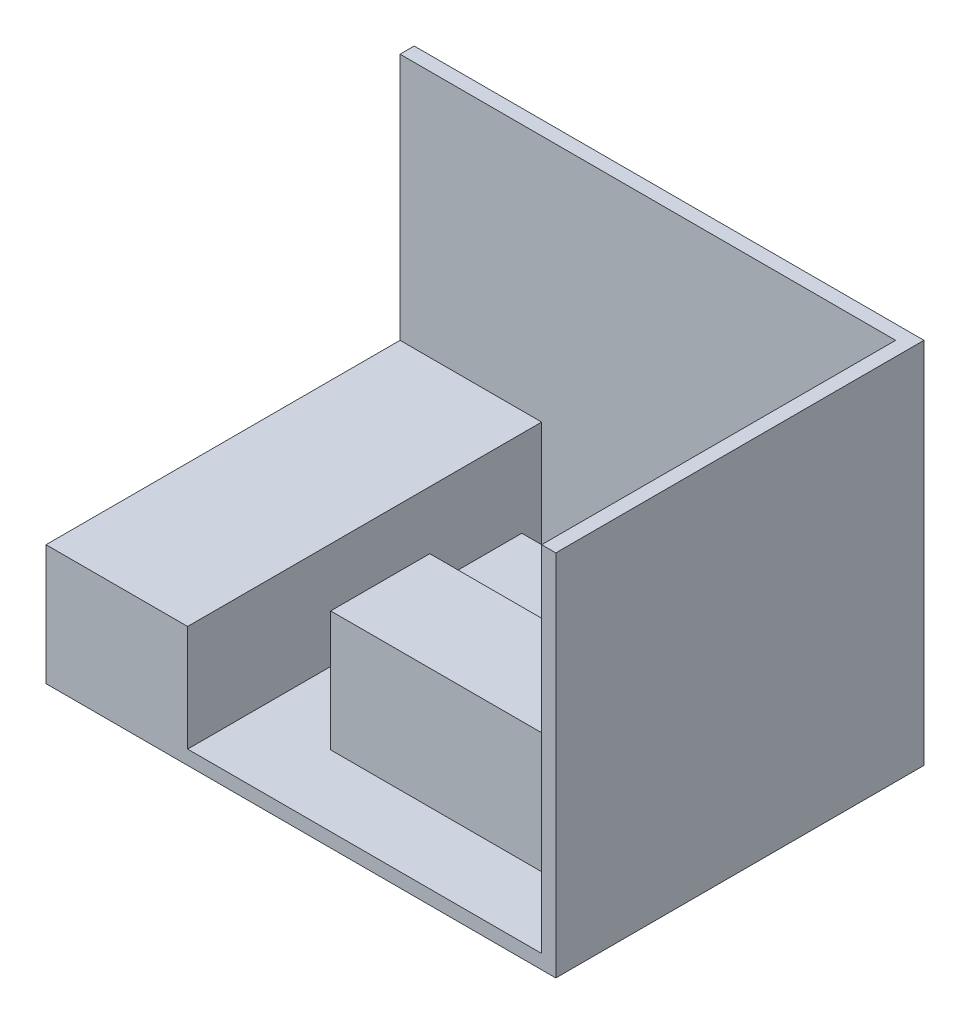
ISO-10303-21;
HEADER;
FILE_DESCRIPTION(('STEP AP214'),'2;1');
FILE_NAME('part.step','',(''),(''),'','','');
FILE_SCHEMA(('AUTOMOTIVE_DESIGN { 1 0 10303 214 1 1 1 1 }'));
ENDSEC;
DATA;
#1=APPLICATION_CONTEXT('core data for automotive mechanical design processes');
#2=APPLICATION_PROTOCOL_DEFINITION('international standard','automotive_design',2000,#1);
#3=PRODUCT_CONTEXT('',#1,'mechanical');
#4=PRODUCT('Part','Part','',(#3));
#5=PRODUCT_RELATED_PRODUCT_CATEGORY('part','',(#4));
#6=PRODUCT_DEFINITION_FORMATION('','',#4);
#7=PRODUCT_DEFINITION_CONTEXT('part definition',#1,'design');
#8=PRODUCT_DEFINITION('design','',#6,#7);
#9=PRODUCT_DEFINITION_SHAPE('','',#8);
#10=(LENGTH_UNIT() NAMED_UNIT(*) SI_UNIT(.MILLI.,.METRE.));
#11=(NAMED_UNIT(*) PLANE_ANGLE_UNIT() SI_UNIT($,.RADIAN.));
#12=(NAMED_UNIT(*) SI_UNIT($,.STERADIAN.) SOLID_ANGLE_UNIT());
#13=UNCERTAINTY_MEASURE_WITH_UNIT(LENGTH_MEASURE(1.E-05),#10,'distance_accuracy_value','');
#14=(GEOMETRIC_REPRESENTATION_CONTEXT(3) GLOBAL_UNCERTAINTY_ASSIGNED_CONTEXT((#13)) GLOBAL_UNIT_ASSIGNED_CONTEXT((#10,
#11,#12)) REPRESENTATION_CONTEXT('',''));
#15=CARTESIAN_POINT('',(0.,0.,0.));
#16=DIRECTION('',(0.,0.,1.));
#17=DIRECTION('',(1.,0.,0.));
#18=AXIS2_PLACEMENT_3D('',#15,#16,#17);
#19=CARTESIAN_POINT('',(0.,100.,0.));
#20=DIRECTION('',(0.,1.,0.));
#21=DIRECTION('',(0.,0.,1.));
#22=AXIS2_PLACEMENT_3D('',#19,#20,#21);
#23=PLANE('',#22);
#24=DIRECTION('',(1.,0.,0.));
#25=VECTOR('',#24,1.);
#26=CARTESIAN_POINT('',(3500.,100.,-2500.));
#27=LINE('',#26,#25);
#28=CARTESIAN_POINT('',(1000.,100.,-2500.));
#29=VERTEX_POINT('',#28);
#30=CARTESIAN_POINT('',(3500.,100.,-2500.));
#31=VERTEX_POINT('',#30);
#32=EDGE_CURVE('E246',#29,#31,#27,.T.);
#33=ORIENTED_EDGE('',*,*,#32,.F.);
#34=DIRECTION('',(0.,0.,-1.));
#35=VECTOR('',#34,1.);
#36=CARTESIAN_POINT('',(1000.,100.,0.));
#37=LINE('',#36,#35);
#38=CARTESIAN_POINT('',(1000.,100.,0.));
#39=VERTEX_POINT('',#38);
#40=EDGE_CURVE('E67',#39,#29,#37,.T.);
#41=ORIENTED_EDGE('',*,*,#40,.F.);
#42=DIRECTION('',(1.,0.,0.));
#43=VECTOR('',#42,1.);
#44=CARTESIAN_POINT('',(0.,100.,0.));
#45=LINE('',#44,#43);
#46=CARTESIAN_POINT('',(3500.,100.,0.));
#47=VERTEX_POINT('',#46);
#48=EDGE_CURVE('E287',#39,#47,#45,.T.);
#49=ORIENTED_EDGE('',*,*,#48,.T.);
#50=DIRECTION('',(0.,0.,1.));
#51=VECTOR('',#50,1.);
#52=CARTESIAN_POINT('',(3500.,100.,-2.22044604925031E-13));
#53=LINE('',#52,#51);
#54=CARTESIAN_POINT('',(3500.,100.,-500.));
#55=VERTEX_POINT('',#54);
#56=EDGE_CURVE('E272',#55,#47,#53,.T.);
#57=ORIENTED_EDGE('',*,*,#56,.F.);
#58=DIRECTION('',(1.,0.,0.));
#59=VECTOR('',#58,1.);
#60=CARTESIAN_POINT('',(3510.,100.,-500.));
#61=LINE('',#60,#59);
#62=CARTESIAN_POINT('',(1510.,100.,-500.));
#63=VERTEX_POINT('',#62);
#64=EDGE_CURVE('E225',#63,#55,#61,.T.);
#65=ORIENTED_EDGE('',*,*,#64,.F.);
#66=DIRECTION('',(0.,0.,1.));
#67=VECTOR('',#66,1.);
#68=CARTESIAN_POINT('',(1510.,100.,-500.));
#69=LINE('',#68,#67);
#70=CARTESIAN_POINT('',(1510.,100.,-1200.));
#71=VERTEX_POINT('',#70);
#72=EDGE_CURVE('E234',#71,#63,#69,.T.);
#73=ORIENTED_EDGE('',*,*,#72,.F.);
#74=DIRECTION('',(-1.,0.,0.));
#75=VECTOR('',#74,1.);
#76=CARTESIAN_POINT('',(3510.,100.,-1200.));
#77=LINE('',#76,#75);
#78=CARTESIAN_POINT('',(3500.,100.,-1200.));
#79=VERTEX_POINT('',#78);
#80=EDGE_CURVE('E220',#79,#71,#77,.T.);
#81=ORIENTED_EDGE('',*,*,#80,.F.);
#82=EDGE_CURVE('E252',#31,#79,#53,.T.);
#83=ORIENTED_EDGE('',*,*,#82,.F.);
#84=EDGE_LOOP('',(#33,#41,#49,#57,#65,#73,#81,#83));
#85=FACE_BOUND('',#84,.T.);
#86=DIRECTION('',(1.,0.,0.));
#87=VECTOR('',#86,1.);
#88=CARTESIAN_POINT('',(1610.,100.,-1250.));
#89=LINE('',#88,#87);
#90=CARTESIAN_POINT('',(1610.,100.,-1250.));
#91=VERTEX_POINT('',#90);
#92=CARTESIAN_POINT('',(2310.,100.,-1250.));
#93=VERTEX_POINT('',#92);
#94=EDGE_CURVE('E510',#91,#93,#89,.T.);
#95=ORIENTED_EDGE('',*,*,#94,.F.);
#96=DIRECTION('',(0.,0.,1.));
#97=VECTOR('',#96,1.);
#98=CARTESIAN_POINT('',(1610.,100.,-1250.));
#99=LINE('',#98,#97);
#100=CARTESIAN_POINT('',(1610.,100.,-1750.));
#101=VERTEX_POINT('',#100);
#102=EDGE_CURVE('E188',#101,#91,#99,.T.);
#103=ORIENTED_EDGE('',*,*,#102,.F.);
#104=DIRECTION('',(-1.,0.,0.));
#105=VECTOR('',#104,1.);
#106=CARTESIAN_POINT('',(1610.,100.,-1750.));
#107=LINE('',#106,#105);
#108=CARTESIAN_POINT('',(2310.,100.,-1750.));
#109=VERTEX_POINT('',#108);
#110=EDGE_CURVE('E184',#109,#101,#107,.T.);
#111=ORIENTED_EDGE('',*,*,#110,.F.);
#112=DIRECTION('',(0.,0.,-1.));
#113=VECTOR('',#112,1.);
#114=CARTESIAN_POINT('',(2310.,100.,-1250.));
#115=LINE('',#114,#113);
#116=EDGE_CURVE('E506',#93,#109,#115,.T.);
#117=ORIENTED_EDGE('',*,*,#116,.F.);
#118=EDGE_LOOP('',(#95,#103,#111,#117));
#119=FACE_BOUND('',#118,.T.);
#120=ADVANCED_FACE('F43',(#85,#119),#23,.T.);
#121=CARTESIAN_POINT('',(3500.,2600.,-2500.));
#122=DIRECTION('',(0.,0.,-1.));
#123=DIRECTION('',(-1.,0.,0.));
#124=AXIS2_PLACEMENT_3D('',#121,#122,#123);
#125=PLANE('',#124);
#126=DIRECTION('',(0.,-1.,0.));
#127=VECTOR('',#126,1.);
#128=CARTESIAN_POINT('',(1000.,850.,-2500.));
#129=LINE('',#128,#127);
#130=CARTESIAN_POINT('',(1000.,850.,-2500.));
#131=VERTEX_POINT('',#130);
#132=EDGE_CURVE('E212',#131,#29,#129,.T.);
#133=ORIENTED_EDGE('',*,*,#132,.T.);
#134=ORIENTED_EDGE('',*,*,#32,.T.);
#135=DIRECTION('',(0.,-1.,0.));
#136=VECTOR('',#135,1.);
#137=CARTESIAN_POINT('',(3500.,2600.,-2500.));
#138=LINE('',#137,#136);
#139=CARTESIAN_POINT('',(3500.,2600.,-2500.));
#140=VERTEX_POINT('',#139);
#141=EDGE_CURVE('E279',#140,#31,#138,.T.);
#142=ORIENTED_EDGE('',*,*,#141,.F.);
#143=DIRECTION('',(1.,0.,0.));
#144=VECTOR('',#143,1.);
#145=CARTESIAN_POINT('',(3500.,2600.,-2500.));
#146=LINE('',#145,#144);
#147=CARTESIAN_POINT('',(0.,2600.,-2500.));
#148=VERTEX_POINT('',#147);
#149=EDGE_CURVE('E259',#148,#140,#146,.T.);
#150=ORIENTED_EDGE('',*,*,#149,.F.);
#151=DIRECTION('',(0.,-1.,0.));
#152=VECTOR('',#151,1.);
#153=CARTESIAN_POINT('',(0.,2600.,-2500.));
#154=LINE('',#153,#152);
#155=CARTESIAN_POINT('',(0.,850.,-2500.));
#156=VERTEX_POINT('',#155);
#157=EDGE_CURVE('E283',#148,#156,#154,.T.);
#158=ORIENTED_EDGE('',*,*,#157,.T.);
#159=DIRECTION('',(-1.,0.,0.));
#160=VECTOR('',#159,1.);
#161=CARTESIAN_POINT('',(0.,850.,-2500.));
#162=LINE('',#161,#160);
#163=EDGE_CURVE('E209',#131,#156,#162,.T.);
#164=ORIENTED_EDGE('',*,*,#163,.F.);
#165=EDGE_LOOP('',(#133,#134,#142,#150,#158,#164));
#166=FACE_BOUND('',#165,.T.);
#167=ADVANCED_FACE('F371',(#166),#125,.F.);
#168=CARTESIAN_POINT('',(3500.,2600.,-2.22044604925031E-13));
#169=DIRECTION('',(1.,0.,0.));
#170=DIRECTION('',(0.,0.,-1.));
#171=AXIS2_PLACEMENT_3D('',#168,#169,#170);
#172=PLANE('',#171);
#173=DIRECTION('',(0.,-1.,0.));
#174=VECTOR('',#173,1.);
#175=CARTESIAN_POINT('',(3500.,2600.,-1200.));
#176=LINE('',#175,#174);
#177=CARTESIAN_POINT('',(3500.,950.,-1200.));
#178=VERTEX_POINT('',#177);
#179=EDGE_CURVE('E11',#178,#79,#176,.T.);
#180=ORIENTED_EDGE('',*,*,#179,.F.);
#181=DIRECTION('',(0.,0.,1.));
#182=VECTOR('',#181,1.);
#183=CARTESIAN_POINT('',(3500.,950.,-2.22044604925031E-13));
#184=LINE('',#183,#182);
#185=CARTESIAN_POINT('',(3500.,950.,-500.));
#186=VERTEX_POINT('',#185);
#187=EDGE_CURVE('E318',#178,#186,#184,.T.);
#188=ORIENTED_EDGE('',*,*,#187,.T.);
#189=DIRECTION('',(0.,1.,0.));
#190=VECTOR('',#189,1.);
#191=CARTESIAN_POINT('',(3500.,2600.,-500.));
#192=LINE('',#191,#190);
#193=EDGE_CURVE('E52',#55,#186,#192,.T.);
#194=ORIENTED_EDGE('',*,*,#193,.F.);
#195=ORIENTED_EDGE('',*,*,#56,.T.);
#196=DIRECTION('',(0.,-1.,0.));
#197=VECTOR('',#196,1.);
#198=CARTESIAN_POINT('',(3500.,2600.,-2.22044604925031E-13));
#199=LINE('',#198,#197);
#200=CARTESIAN_POINT('',(3500.,2600.,-2.22044604925031E-13));
#201=VERTEX_POINT('',#200);
#202=EDGE_CURVE('E269',#201,#47,#199,.T.);
#203=ORIENTED_EDGE('',*,*,#202,.F.);
#204=DIRECTION('',(0.,0.,1.));
#205=VECTOR('',#204,1.);
#206=CARTESIAN_POINT('',(3500.,2600.,-2.22044604925031E-13));
#207=LINE('',#206,#205);
#208=EDGE_CURVE('E262',#140,#201,#207,.T.);
#209=ORIENTED_EDGE('',*,*,#208,.F.);
#210=ORIENTED_EDGE('',*,*,#141,.T.);
#211=ORIENTED_EDGE('',*,*,#82,.T.);
#212=EDGE_LOOP('',(#180,#188,#194,#195,#203,#209,#210,#211));
#213=FACE_BOUND('',#212,.T.);
#214=ADVANCED_FACE('F332',(#213),#172,.F.);
#215=CARTESIAN_POINT('',(0.,100.,-2600.));
#216=DIRECTION('',(1.,0.,0.));
#217=DIRECTION('',(0.,0.,-1.));
#218=AXIS2_PLACEMENT_3D('',#215,#216,#217);
#219=PLANE('',#218);
#220=DIRECTION('',(0.,-1.,0.));
#221=VECTOR('',#220,1.);
#222=CARTESIAN_POINT('',(0.,100.,0.));
#223=LINE('',#222,#221);
#224=CARTESIAN_POINT('',(0.,850.,0.));
#225=VERTEX_POINT('',#224);
#226=CARTESIAN_POINT('',(0.,0.,0.));
#227=VERTEX_POINT('',#226);
#228=EDGE_CURVE('E314',#225,#227,#223,.T.);
#229=ORIENTED_EDGE('',*,*,#228,.F.);
#230=DIRECTION('',(0.,0.,1.));
#231=VECTOR('',#230,1.);
#232=CARTESIAN_POINT('',(0.,850.,0.));
#233=LINE('',#232,#231);
#234=EDGE_CURVE('E194',#156,#225,#233,.T.);
#235=ORIENTED_EDGE('',*,*,#234,.F.);
#236=ORIENTED_EDGE('',*,*,#157,.F.);
#237=DIRECTION('',(0.,0.,1.));
#238=VECTOR('',#237,1.);
#239=CARTESIAN_POINT('',(0.,2600.,-2500.));
#240=LINE('',#239,#238);
#241=CARTESIAN_POINT('',(0.,2600.,-2600.));
#242=VERTEX_POINT('',#241);
#243=EDGE_CURVE('E256',#242,#148,#240,.T.);
#244=ORIENTED_EDGE('',*,*,#243,.F.);
#245=DIRECTION('',(0.,-1.,0.));
#246=VECTOR('',#245,1.);
#247=CARTESIAN_POINT('',(0.,100.,-2600.));
#248=LINE('',#247,#246);
#249=CARTESIAN_POINT('',(0.,0.,-2600.));
#250=VERTEX_POINT('',#249);
#251=EDGE_CURVE('E290',#242,#250,#248,.T.);
#252=ORIENTED_EDGE('',*,*,#251,.T.);
#253=DIRECTION('',(0.,0.,1.));
#254=VECTOR('',#253,1.);
#255=CARTESIAN_POINT('',(0.,0.,-2600.));
#256=LINE('',#255,#254);
#257=EDGE_CURVE('E286',#250,#227,#256,.T.);
#258=ORIENTED_EDGE('',*,*,#257,.T.);
#259=EDGE_LOOP('',(#229,#235,#236,#244,#252,#258));
#260=FACE_BOUND('',#259,.T.);
#261=ADVANCED_FACE('F45',(#260),#219,.F.);
#262=CARTESIAN_POINT('',(0.,100.,0.));
#263=DIRECTION('',(0.,0.,-1.));
#264=DIRECTION('',(-1.,0.,0.));
#265=AXIS2_PLACEMENT_3D('',#262,#263,#264);
#266=PLANE('',#265);
#267=DIRECTION('',(1.,0.,0.));
#268=VECTOR('',#267,1.);
#269=CARTESIAN_POINT('',(0.,0.,0.));
#270=LINE('',#269,#268);
#271=CARTESIAN_POINT('',(3600.,0.,0.));
#272=VERTEX_POINT('',#271);
#273=EDGE_CURVE('E295',#227,#272,#270,.T.);
#274=ORIENTED_EDGE('',*,*,#273,.T.);
#275=DIRECTION('',(0.,-1.,0.));
#276=VECTOR('',#275,1.);
#277=CARTESIAN_POINT('',(3600.,100.,0.));
#278=LINE('',#277,#276);
#279=CARTESIAN_POINT('',(3600.,2600.,0.));
#280=VERTEX_POINT('',#279);
#281=EDGE_CURVE('E310',#280,#272,#278,.T.);
#282=ORIENTED_EDGE('',*,*,#281,.F.);
#283=DIRECTION('',(1.,0.,0.));
#284=VECTOR('',#283,1.);
#285=CARTESIAN_POINT('',(3600.,2600.,0.));
#286=LINE('',#285,#284);
#287=EDGE_CURVE('E265',#201,#280,#286,.T.);
#288=ORIENTED_EDGE('',*,*,#287,.F.);
#289=ORIENTED_EDGE('',*,*,#202,.T.);
#290=ORIENTED_EDGE('',*,*,#48,.F.);
#291=DIRECTION('',(0.,-1.,0.));
#292=VECTOR('',#291,1.);
#293=CARTESIAN_POINT('',(1000.,850.,0.));
#294=LINE('',#293,#292);
#295=CARTESIAN_POINT('',(1000.,850.,0.));
#296=VERTEX_POINT('',#295);
#297=EDGE_CURVE('E216',#296,#39,#294,.T.);
#298=ORIENTED_EDGE('',*,*,#297,.F.);
#299=DIRECTION('',(1.,0.,0.));
#300=VECTOR('',#299,1.);
#301=CARTESIAN_POINT('',(0.,850.,0.));
#302=LINE('',#301,#300);
#303=EDGE_CURVE('E202',#225,#296,#302,.T.);
#304=ORIENTED_EDGE('',*,*,#303,.F.);
#305=ORIENTED_EDGE('',*,*,#228,.T.);
#306=EDGE_LOOP('',(#274,#282,#288,#289,#290,#298,#304,#305));
#307=FACE_BOUND('',#306,.T.);
#308=ADVANCED_FACE('F351',(#307),#266,.F.);
#309=CARTESIAN_POINT('',(3600.,100.,-2600.));
#310=DIRECTION('',(-1.,0.,0.));
#311=DIRECTION('',(0.,0.,1.));
#312=AXIS2_PLACEMENT_3D('',#309,#310,#311);
#313=PLANE('',#312);
#314=DIRECTION('',(0.,0.,-1.));
#315=VECTOR('',#314,1.);
#316=CARTESIAN_POINT('',(3600.,0.,-2600.));
#317=LINE('',#316,#315);
#318=CARTESIAN_POINT('',(3600.,0.,-2600.));
#319=VERTEX_POINT('',#318);
#320=EDGE_CURVE('E298',#272,#319,#317,.T.);
#321=ORIENTED_EDGE('',*,*,#320,.T.);
#322=DIRECTION('',(0.,-1.,0.));
#323=VECTOR('',#322,1.);
#324=CARTESIAN_POINT('',(3600.,100.,-2600.));
#325=LINE('',#324,#323);
#326=CARTESIAN_POINT('',(3600.,2600.,-2600.));
#327=VERTEX_POINT('',#326);
#328=EDGE_CURVE('E306',#327,#319,#325,.T.);
#329=ORIENTED_EDGE('',*,*,#328,.F.);
#330=DIRECTION('',(0.,0.,-1.));
#331=VECTOR('',#330,1.);
#332=CARTESIAN_POINT('',(3600.,2600.,-2600.));
#333=LINE('',#332,#331);
#334=EDGE_CURVE('E247',#280,#327,#333,.T.);
#335=ORIENTED_EDGE('',*,*,#334,.F.);
#336=ORIENTED_EDGE('',*,*,#281,.T.);
#337=EDGE_LOOP('',(#321,#329,#335,#336));
#338=FACE_BOUND('',#337,.T.);
#339=ADVANCED_FACE('F357',(#338),#313,.F.);
#340=CARTESIAN_POINT('',(0.,100.,-2600.));
#341=DIRECTION('',(0.,0.,1.));
#342=DIRECTION('',(1.,0.,0.));
#343=AXIS2_PLACEMENT_3D('',#340,#341,#342);
#344=PLANE('',#343);
#345=DIRECTION('',(-1.,0.,0.));
#346=VECTOR('',#345,1.);
#347=CARTESIAN_POINT('',(0.,0.,-2600.));
#348=LINE('',#347,#346);
#349=EDGE_CURVE('E291',#319,#250,#348,.T.);
#350=ORIENTED_EDGE('',*,*,#349,.T.);
#351=ORIENTED_EDGE('',*,*,#251,.F.);
#352=DIRECTION('',(-1.,0.,0.));
#353=VECTOR('',#352,1.);
#354=CARTESIAN_POINT('',(0.,2600.,-2600.));
#355=LINE('',#354,#353);
#356=EDGE_CURVE('E251',#327,#242,#355,.T.);
#357=ORIENTED_EDGE('',*,*,#356,.F.);
#358=ORIENTED_EDGE('',*,*,#328,.T.);
#359=EDGE_LOOP('',(#350,#351,#357,#358));
#360=FACE_BOUND('',#359,.T.);
#361=ADVANCED_FACE('F362',(#360),#344,.F.);
#362=CARTESIAN_POINT('',(0.,0.,0.));
#363=DIRECTION('',(0.,1.,0.));
#364=DIRECTION('',(0.,0.,1.));
#365=AXIS2_PLACEMENT_3D('',#362,#363,#364);
#366=PLANE('',#365);
#367=ORIENTED_EDGE('',*,*,#257,.F.);
#368=ORIENTED_EDGE('',*,*,#349,.F.);
#369=ORIENTED_EDGE('',*,*,#320,.F.);
#370=ORIENTED_EDGE('',*,*,#273,.F.);
#371=EDGE_LOOP('',(#367,#368,#369,#370));
#372=FACE_BOUND('',#371,.T.);
#373=ADVANCED_FACE('F396',(#372),#366,.F.);
#374=CARTESIAN_POINT('',(0.,2600.,0.));
#375=DIRECTION('',(0.,-1.,0.));
#376=DIRECTION('',(0.,0.,-1.));
#377=AXIS2_PLACEMENT_3D('',#374,#375,#376);
#378=PLANE('',#377);
#379=ORIENTED_EDGE('',*,*,#334,.T.);
#380=ORIENTED_EDGE('',*,*,#356,.T.);
#381=ORIENTED_EDGE('',*,*,#243,.T.);
#382=ORIENTED_EDGE('',*,*,#149,.T.);
#383=ORIENTED_EDGE('',*,*,#208,.T.);
#384=ORIENTED_EDGE('',*,*,#287,.T.);
#385=EDGE_LOOP('',(#379,#380,#381,#382,#383,#384));
#386=FACE_BOUND('',#385,.T.);
#387=ADVANCED_FACE('F355',(#386),#378,.F.);
#388=CARTESIAN_POINT('',(3510.,950.,-1200.));
#389=DIRECTION('',(0.,0.,1.));
#390=DIRECTION('',(1.,0.,0.));
#391=AXIS2_PLACEMENT_3D('',#388,#389,#390);
#392=PLANE('',#391);
#393=DIRECTION('',(-1.,0.,0.));
#394=VECTOR('',#393,1.);
#395=CARTESIAN_POINT('',(3510.,950.,-1200.));
#396=LINE('',#395,#394);
#397=CARTESIAN_POINT('',(1510.,950.,-1200.));
#398=VERTEX_POINT('',#397);
#399=EDGE_CURVE('E221',#178,#398,#396,.T.);
#400=ORIENTED_EDGE('',*,*,#399,.F.);
#401=ORIENTED_EDGE('',*,*,#179,.T.);
#402=ORIENTED_EDGE('',*,*,#80,.T.);
#403=DIRECTION('',(0.,-1.,0.));
#404=VECTOR('',#403,1.);
#405=CARTESIAN_POINT('',(1510.,950.,-1200.));
#406=LINE('',#405,#404);
#407=EDGE_CURVE('E242',#398,#71,#406,.T.);
#408=ORIENTED_EDGE('',*,*,#407,.F.);
#409=EDGE_LOOP('',(#400,#401,#402,#408));
#410=FACE_BOUND('',#409,.T.);
#411=ADVANCED_FACE('F338',(#410),#392,.F.);
#412=CARTESIAN_POINT('',(3510.,950.,-500.));
#413=DIRECTION('',(0.,0.,-1.));
#414=DIRECTION('',(-1.,0.,0.));
#415=AXIS2_PLACEMENT_3D('',#412,#413,#414);
#416=PLANE('',#415);
#417=ORIENTED_EDGE('',*,*,#64,.T.);
#418=ORIENTED_EDGE('',*,*,#193,.T.);
#419=DIRECTION('',(1.,0.,0.));
#420=VECTOR('',#419,1.);
#421=CARTESIAN_POINT('',(3510.,950.,-500.));
#422=LINE('',#421,#420);
#423=CARTESIAN_POINT('',(1510.,950.,-500.));
#424=VERTEX_POINT('',#423);
#425=EDGE_CURVE('E228',#424,#186,#422,.T.);
#426=ORIENTED_EDGE('',*,*,#425,.F.);
#427=DIRECTION('',(0.,-1.,0.));
#428=VECTOR('',#427,1.);
#429=CARTESIAN_POINT('',(1510.,950.,-500.));
#430=LINE('',#429,#428);
#431=EDGE_CURVE('E231',#424,#63,#430,.T.);
#432=ORIENTED_EDGE('',*,*,#431,.T.);
#433=EDGE_LOOP('',(#417,#418,#426,#432));
#434=FACE_BOUND('',#433,.T.);
#435=ADVANCED_FACE('F326',(#434),#416,.F.);
#436=CARTESIAN_POINT('',(0.,950.,0.));
#437=DIRECTION('',(0.,1.,0.));
#438=DIRECTION('',(0.,0.,1.));
#439=AXIS2_PLACEMENT_3D('',#436,#437,#438);
#440=PLANE('',#439);
#441=ORIENTED_EDGE('',*,*,#187,.F.);
#442=ORIENTED_EDGE('',*,*,#399,.T.);
#443=DIRECTION('',(0.,0.,1.));
#444=VECTOR('',#443,1.);
#445=CARTESIAN_POINT('',(1510.,950.,-500.));
#446=LINE('',#445,#444);
#447=EDGE_CURVE('E224',#398,#424,#446,.T.);
#448=ORIENTED_EDGE('',*,*,#447,.T.);
#449=ORIENTED_EDGE('',*,*,#425,.T.);
#450=EDGE_LOOP('',(#441,#442,#448,#449));
#451=FACE_BOUND('',#450,.T.);
#452=ADVANCED_FACE('F335',(#451),#440,.T.);
#453=CARTESIAN_POINT('',(1510.,950.,-500.));
#454=DIRECTION('',(1.,0.,0.));
#455=DIRECTION('',(0.,0.,-1.));
#456=AXIS2_PLACEMENT_3D('',#453,#454,#455);
#457=PLANE('',#456);
#458=ORIENTED_EDGE('',*,*,#72,.T.);
#459=ORIENTED_EDGE('',*,*,#431,.F.);
#460=ORIENTED_EDGE('',*,*,#447,.F.);
#461=ORIENTED_EDGE('',*,*,#407,.T.);
#462=EDGE_LOOP('',(#458,#459,#460,#461));
#463=FACE_BOUND('',#462,.T.);
#464=ADVANCED_FACE('F344',(#463),#457,.F.);
#465=CARTESIAN_POINT('',(1000.,850.,0.));
#466=DIRECTION('',(-1.,0.,0.));
#467=DIRECTION('',(0.,0.,1.));
#468=AXIS2_PLACEMENT_3D('',#465,#466,#467);
#469=PLANE('',#468);
#470=ORIENTED_EDGE('',*,*,#40,.T.);
#471=ORIENTED_EDGE('',*,*,#132,.F.);
#472=DIRECTION('',(0.,0.,-1.));
#473=VECTOR('',#472,1.);
#474=CARTESIAN_POINT('',(1000.,850.,0.));
#475=LINE('',#474,#473);
#476=EDGE_CURVE('E205',#296,#131,#475,.T.);
#477=ORIENTED_EDGE('',*,*,#476,.F.);
#478=ORIENTED_EDGE('',*,*,#297,.T.);
#479=EDGE_LOOP('',(#470,#471,#477,#478));
#480=FACE_BOUND('',#479,.T.);
#481=ADVANCED_FACE('F375',(#480),#469,.F.);
#482=CARTESIAN_POINT('',(0.,850.,0.));
#483=DIRECTION('',(0.,-1.,0.));
#484=DIRECTION('',(0.,0.,-1.));
#485=AXIS2_PLACEMENT_3D('',#482,#483,#484);
#486=PLANE('',#485);
#487=ORIENTED_EDGE('',*,*,#234,.T.);
#488=ORIENTED_EDGE('',*,*,#303,.T.);
#489=ORIENTED_EDGE('',*,*,#476,.T.);
#490=ORIENTED_EDGE('',*,*,#163,.T.);
#491=EDGE_LOOP('',(#487,#488,#489,#490));
#492=FACE_BOUND('',#491,.T.);
#493=ADVANCED_FACE('F379',(#492),#486,.F.);
#494=CARTESIAN_POINT('',(1610.,850.,-1250.));
#495=DIRECTION('',(1.,0.,0.));
#496=DIRECTION('',(0.,0.,-1.));
#497=AXIS2_PLACEMENT_3D('',#494,#495,#496);
#498=PLANE('',#497);
#499=ORIENTED_EDGE('',*,*,#102,.T.);
#500=DIRECTION('',(0.,-1.,0.));
#501=VECTOR('',#500,1.);
#502=CARTESIAN_POINT('',(1610.,850.,-1250.));
#503=LINE('',#502,#501);
#504=CARTESIAN_POINT('',(1610.,850.,-1250.));
#505=VERTEX_POINT('',#504);
#506=EDGE_CURVE('E167',#505,#91,#503,.T.);
#507=ORIENTED_EDGE('',*,*,#506,.F.);
#508=DIRECTION('',(0.,0.,1.));
#509=VECTOR('',#508,1.);
#510=CARTESIAN_POINT('',(1610.,850.,-1250.));
#511=LINE('',#510,#509);
#512=CARTESIAN_POINT('',(1610.,850.,-1750.));
#513=VERTEX_POINT('',#512);
#514=EDGE_CURVE('E175',#513,#505,#511,.T.);
#515=ORIENTED_EDGE('',*,*,#514,.F.);
#516=DIRECTION('',(0.,-1.,0.));
#517=VECTOR('',#516,1.);
#518=CARTESIAN_POINT('',(1610.,850.,-1750.));
#519=LINE('',#518,#517);
#520=EDGE_CURVE('E503',#513,#101,#519,.T.);
#521=ORIENTED_EDGE('',*,*,#520,.T.);
#522=EDGE_LOOP('',(#499,#507,#515,#521));
#523=FACE_BOUND('',#522,.T.);
#524=ADVANCED_FACE('F186',(#523),#498,.F.);
#525=CARTESIAN_POINT('',(1610.,850.,-1250.));
#526=DIRECTION('',(0.,0.,-1.));
#527=DIRECTION('',(-1.,0.,0.));
#528=AXIS2_PLACEMENT_3D('',#525,#526,#527);
#529=PLANE('',#528);
#530=ORIENTED_EDGE('',*,*,#94,.T.);
#531=DIRECTION('',(0.,-1.,0.));
#532=VECTOR('',#531,1.);
#533=CARTESIAN_POINT('',(2310.,850.,-1250.));
#534=LINE('',#533,#532);
#535=CARTESIAN_POINT('',(2310.,850.,-1250.));
#536=VERTEX_POINT('',#535);
#537=EDGE_CURVE('E170',#536,#93,#534,.T.);
#538=ORIENTED_EDGE('',*,*,#537,.F.);
#539=DIRECTION('',(1.,0.,0.));
#540=VECTOR('',#539,1.);
#541=CARTESIAN_POINT('',(1610.,850.,-1250.));
#542=LINE('',#541,#540);
#543=EDGE_CURVE('E163',#505,#536,#542,.T.);
#544=ORIENTED_EDGE('',*,*,#543,.F.);
#545=ORIENTED_EDGE('',*,*,#506,.T.);
#546=EDGE_LOOP('',(#530,#538,#544,#545));
#547=FACE_BOUND('',#546,.T.);
#548=ADVANCED_FACE('F165',(#547),#529,.F.);
#549=CARTESIAN_POINT('',(2310.,850.,-1250.));
#550=DIRECTION('',(-1.,0.,0.));
#551=DIRECTION('',(0.,0.,1.));
#552=AXIS2_PLACEMENT_3D('',#549,#550,#551);
#553=PLANE('',#552);
#554=ORIENTED_EDGE('',*,*,#116,.T.);
#555=DIRECTION('',(0.,-1.,0.));
#556=VECTOR('',#555,1.);
#557=CARTESIAN_POINT('',(2310.,850.,-1750.));
#558=LINE('',#557,#556);
#559=CARTESIAN_POINT('',(2310.,850.,-1750.));
#560=VERTEX_POINT('',#559);
#561=EDGE_CURVE('E59',#560,#109,#558,.T.);
#562=ORIENTED_EDGE('',*,*,#561,.F.);
#563=DIRECTION('',(0.,0.,-1.));
#564=VECTOR('',#563,1.);
#565=CARTESIAN_POINT('',(2310.,850.,-1250.));
#566=LINE('',#565,#564);
#567=EDGE_CURVE('E174',#536,#560,#566,.T.);
#568=ORIENTED_EDGE('',*,*,#567,.F.);
#569=ORIENTED_EDGE('',*,*,#537,.T.);
#570=EDGE_LOOP('',(#554,#562,#568,#569));
#571=FACE_BOUND('',#570,.T.);
#572=ADVANCED_FACE('F463',(#571),#553,.F.);
#573=CARTESIAN_POINT('',(1610.,850.,-1750.));
#574=DIRECTION('',(0.,0.,1.));
#575=DIRECTION('',(1.,0.,0.));
#576=AXIS2_PLACEMENT_3D('',#573,#574,#575);
#577=PLANE('',#576);
#578=ORIENTED_EDGE('',*,*,#110,.T.);
#579=ORIENTED_EDGE('',*,*,#520,.F.);
#580=DIRECTION('',(-1.,0.,0.));
#581=VECTOR('',#580,1.);
#582=CARTESIAN_POINT('',(1610.,850.,-1750.));
#583=LINE('',#582,#581);
#584=EDGE_CURVE('E179',#560,#513,#583,.T.);
#585=ORIENTED_EDGE('',*,*,#584,.F.);
#586=ORIENTED_EDGE('',*,*,#561,.T.);
#587=EDGE_LOOP('',(#578,#579,#585,#586));
#588=FACE_BOUND('',#587,.T.);
#589=ADVANCED_FACE('F473',(#588),#577,.F.);
#590=CARTESIAN_POINT('',(0.,850.,0.));
#591=DIRECTION('',(0.,-1.,0.));
#592=DIRECTION('',(0.,0.,-1.));
#593=AXIS2_PLACEMENT_3D('',#590,#591,#592);
#594=PLANE('',#593);
#595=ORIENTED_EDGE('',*,*,#514,.T.);
#596=ORIENTED_EDGE('',*,*,#543,.T.);
#597=ORIENTED_EDGE('',*,*,#567,.T.);
#598=ORIENTED_EDGE('',*,*,#584,.T.);
#599=EDGE_LOOP('',(#595,#596,#597,#598));
#600=FACE_BOUND('',#599,.T.);
#601=ADVANCED_FACE('F178',(#600),#594,.F.);
#602=CLOSED_SHELL('',(#120,#167,#214,#261,#308,#339,#361,#373,#387,#411,#435,#452,#464,#481,
#493,#524,#548,#572,#589,#601));
#603=MANIFOLD_SOLID_BREP('B2',#602);
#604=ADVANCED_BREP_SHAPE_REPRESENTATION('',(#18,#603),#14);
#605=SHAPE_DEFINITION_REPRESENTATION(#9,#604);
ENDSEC;
END-ISO-10303-21;
